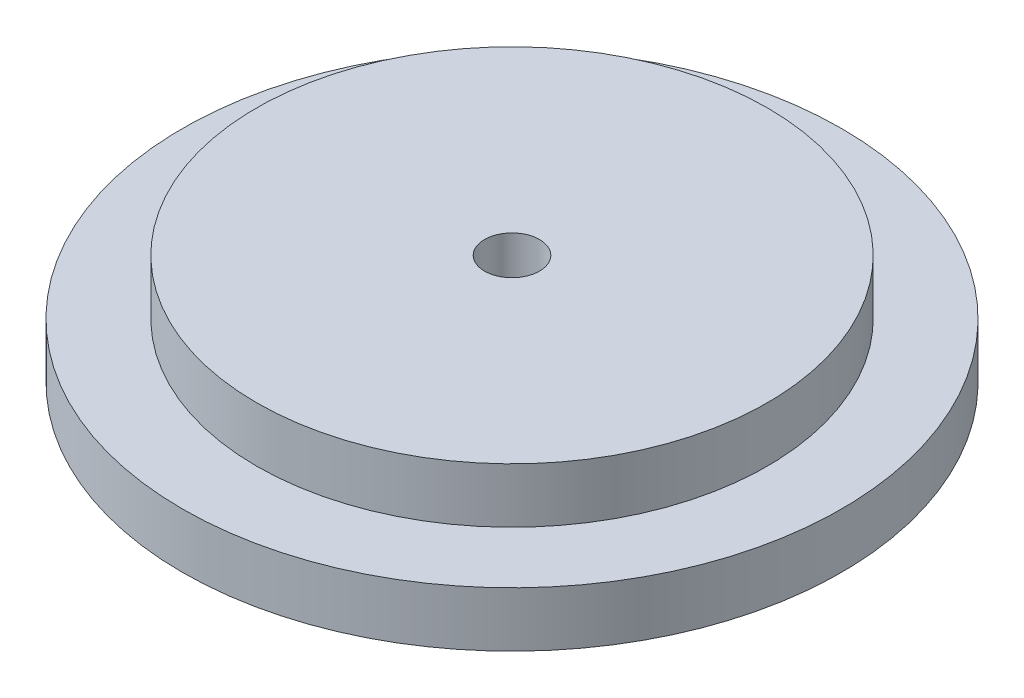
ISO-10303-21;
HEADER;
FILE_DESCRIPTION(('STEP AP214'),'2;1');
FILE_NAME('part.step','',(''),(''),'','','');
FILE_SCHEMA(('AUTOMOTIVE_DESIGN { 1 0 10303 214 1 1 1 1 }'));
ENDSEC;
DATA;
#1=APPLICATION_CONTEXT('core data for automotive mechanical design processes');
#2=APPLICATION_PROTOCOL_DEFINITION('international standard','automotive_design',2000,#1);
#3=PRODUCT_CONTEXT('',#1,'mechanical');
#4=PRODUCT('Part','Part','',(#3));
#5=PRODUCT_RELATED_PRODUCT_CATEGORY('part','',(#4));
#6=PRODUCT_DEFINITION_FORMATION('','',#4);
#7=PRODUCT_DEFINITION_CONTEXT('part definition',#1,'design');
#8=PRODUCT_DEFINITION('design','',#6,#7);
#9=PRODUCT_DEFINITION_SHAPE('','',#8);
#10=(LENGTH_UNIT() NAMED_UNIT(*) SI_UNIT(.MILLI.,.METRE.));
#11=(NAMED_UNIT(*) PLANE_ANGLE_UNIT() SI_UNIT($,.RADIAN.));
#12=(NAMED_UNIT(*) SI_UNIT($,.STERADIAN.) SOLID_ANGLE_UNIT());
#13=UNCERTAINTY_MEASURE_WITH_UNIT(LENGTH_MEASURE(1.E-05),#10,'distance_accuracy_value','');
#14=(GEOMETRIC_REPRESENTATION_CONTEXT(3) GLOBAL_UNCERTAINTY_ASSIGNED_CONTEXT((#13)) GLOBAL_UNIT_ASSIGNED_CONTEXT((#10,
#11,#12)) REPRESENTATION_CONTEXT('',''));
#15=CARTESIAN_POINT('',(0.,0.,0.));
#16=DIRECTION('',(0.,0.,1.));
#17=DIRECTION('',(1.,0.,0.));
#18=AXIS2_PLACEMENT_3D('',#15,#16,#17);
#19=CARTESIAN_POINT('',(0.,-10.,0.));
#20=DIRECTION('',(0.,1.,0.));
#21=DIRECTION('',(0.,0.,1.));
#22=AXIS2_PLACEMENT_3D('',#19,#20,#21);
#23=CYLINDRICAL_SURFACE('',#22,60.);
#24=CARTESIAN_POINT('',(0.,-10.,0.));
#25=DIRECTION('',(0.,-1.,0.));
#26=DIRECTION('',(0.,0.,-1.));
#27=AXIS2_PLACEMENT_3D('',#24,#25,#26);
#28=CIRCLE('',#27,60.);
#29=CARTESIAN_POINT('',(0.,-10.,-60.));
#30=VERTEX_POINT('',#29);
#31=EDGE_CURVE('E10',#30,#30,#28,.T.);
#32=ORIENTED_EDGE('',*,*,#31,.F.);
#33=EDGE_LOOP('',(#32));
#34=FACE_BOUND('',#33,.T.);
#35=CARTESIAN_POINT('',(0.,0.,0.));
#36=DIRECTION('',(0.,-1.,0.));
#37=DIRECTION('',(0.,0.,-1.));
#38=AXIS2_PLACEMENT_3D('',#35,#36,#37);
#39=CIRCLE('',#38,60.);
#40=CARTESIAN_POINT('',(0.,0.,-60.));
#41=VERTEX_POINT('',#40);
#42=EDGE_CURVE('E35',#41,#41,#39,.T.);
#43=ORIENTED_EDGE('',*,*,#42,.T.);
#44=EDGE_LOOP('',(#43));
#45=FACE_BOUND('',#44,.T.);
#46=ADVANCED_FACE('F31',(#34,#45),#23,.T.);
#47=CARTESIAN_POINT('',(0.,-10.,0.));
#48=DIRECTION('',(0.,-1.,0.));
#49=DIRECTION('',(0.,0.,-1.));
#50=AXIS2_PLACEMENT_3D('',#47,#48,#49);
#51=PLANE('',#50);
#52=CARTESIAN_POINT('',(0.,-10.,0.));
#53=DIRECTION('',(0.,1.,0.));
#54=DIRECTION('',(0.,0.,1.));
#55=AXIS2_PLACEMENT_3D('',#52,#53,#54);
#56=CIRCLE('',#55,5.);
#57=CARTESIAN_POINT('',(0.,-10.,5.));
#58=VERTEX_POINT('',#57);
#59=EDGE_CURVE('E47',#58,#58,#56,.T.);
#60=ORIENTED_EDGE('',*,*,#59,.T.);
#61=EDGE_LOOP('',(#60));
#62=FACE_BOUND('',#61,.T.);
#63=ORIENTED_EDGE('',*,*,#31,.T.);
#64=EDGE_LOOP('',(#63));
#65=FACE_BOUND('',#64,.T.);
#66=ADVANCED_FACE('F56',(#62,#65),#51,.T.);
#67=CARTESIAN_POINT('',(0.,0.,0.));
#68=DIRECTION('',(0.,-1.,0.));
#69=DIRECTION('',(0.,0.,-1.));
#70=AXIS2_PLACEMENT_3D('',#67,#68,#69);
#71=PLANE('',#70);
#72=ORIENTED_EDGE('',*,*,#42,.F.);
#73=EDGE_LOOP('',(#72));
#74=FACE_BOUND('',#73,.T.);
#75=CARTESIAN_POINT('',(0.,0.,0.));
#76=DIRECTION('',(0.,-1.,0.));
#77=DIRECTION('',(0.,0.,-1.));
#78=AXIS2_PLACEMENT_3D('',#75,#76,#77);
#79=CIRCLE('',#78,46.5);
#80=CARTESIAN_POINT('',(0.,0.,-46.5));
#81=VERTEX_POINT('',#80);
#82=EDGE_CURVE('E42',#81,#81,#79,.F.);
#83=ORIENTED_EDGE('',*,*,#82,.F.);
#84=EDGE_LOOP('',(#83));
#85=FACE_BOUND('',#84,.T.);
#86=ADVANCED_FACE('F71',(#74,#85),#71,.F.);
#87=CARTESIAN_POINT('',(0.,-135.481659275343,0.));
#88=DIRECTION('',(0.,1.,0.));
#89=DIRECTION('',(0.,0.,1.));
#90=AXIS2_PLACEMENT_3D('',#87,#88,#89);
#91=CYLINDRICAL_SURFACE('',#90,46.5);
#92=CARTESIAN_POINT('',(0.,10.,0.));
#93=DIRECTION('',(0.,1.,0.));
#94=DIRECTION('',(0.,0.,1.));
#95=AXIS2_PLACEMENT_3D('',#92,#93,#94);
#96=CIRCLE('',#95,46.5);
#97=CARTESIAN_POINT('',(0.,10.,46.5));
#98=VERTEX_POINT('',#97);
#99=EDGE_CURVE('E44',#98,#98,#96,.T.);
#100=ORIENTED_EDGE('',*,*,#99,.F.);
#101=EDGE_LOOP('',(#100));
#102=FACE_BOUND('',#101,.T.);
#103=ORIENTED_EDGE('',*,*,#82,.T.);
#104=EDGE_LOOP('',(#103));
#105=FACE_BOUND('',#104,.T.);
#106=ADVANCED_FACE('F66',(#102,#105),#91,.T.);
#107=CARTESIAN_POINT('',(0.,10.,0.));
#108=DIRECTION('',(0.,1.,0.));
#109=DIRECTION('',(0.,0.,1.));
#110=AXIS2_PLACEMENT_3D('',#107,#108,#109);
#111=PLANE('',#110);
#112=CARTESIAN_POINT('',(0.,10.,0.));
#113=DIRECTION('',(0.,1.,0.));
#114=DIRECTION('',(0.,0.,1.));
#115=AXIS2_PLACEMENT_3D('',#112,#113,#114);
#116=CIRCLE('',#115,5.);
#117=CARTESIAN_POINT('',(0.,10.,5.));
#118=VERTEX_POINT('',#117);
#119=EDGE_CURVE('E50',#118,#118,#116,.T.);
#120=ORIENTED_EDGE('',*,*,#119,.F.);
#121=EDGE_LOOP('',(#120));
#122=FACE_BOUND('',#121,.T.);
#123=ORIENTED_EDGE('',*,*,#99,.T.);
#124=EDGE_LOOP('',(#123));
#125=FACE_BOUND('',#124,.T.);
#126=ADVANCED_FACE('F33',(#122,#125),#111,.T.);
#127=CARTESIAN_POINT('',(0.,-10.,0.));
#128=DIRECTION('',(0.,1.,0.));
#129=DIRECTION('',(0.,0.,1.));
#130=AXIS2_PLACEMENT_3D('',#127,#128,#129);
#131=CYLINDRICAL_SURFACE('',#130,5.);
#132=ORIENTED_EDGE('',*,*,#59,.F.);
#133=EDGE_LOOP('',(#132));
#134=FACE_BOUND('',#133,.T.);
#135=ORIENTED_EDGE('',*,*,#119,.T.);
#136=EDGE_LOOP('',(#135));
#137=FACE_BOUND('',#136,.T.);
#138=ADVANCED_FACE('F58',(#134,#137),#131,.F.);
#139=CLOSED_SHELL('',(#46,#66,#86,#106,#126,#138));
#140=MANIFOLD_SOLID_BREP('B2',#139);
#141=ADVANCED_BREP_SHAPE_REPRESENTATION('',(#18,#140),#14);
#142=SHAPE_DEFINITION_REPRESENTATION(#9,#141);
ENDSEC;
END-ISO-10303-21;
